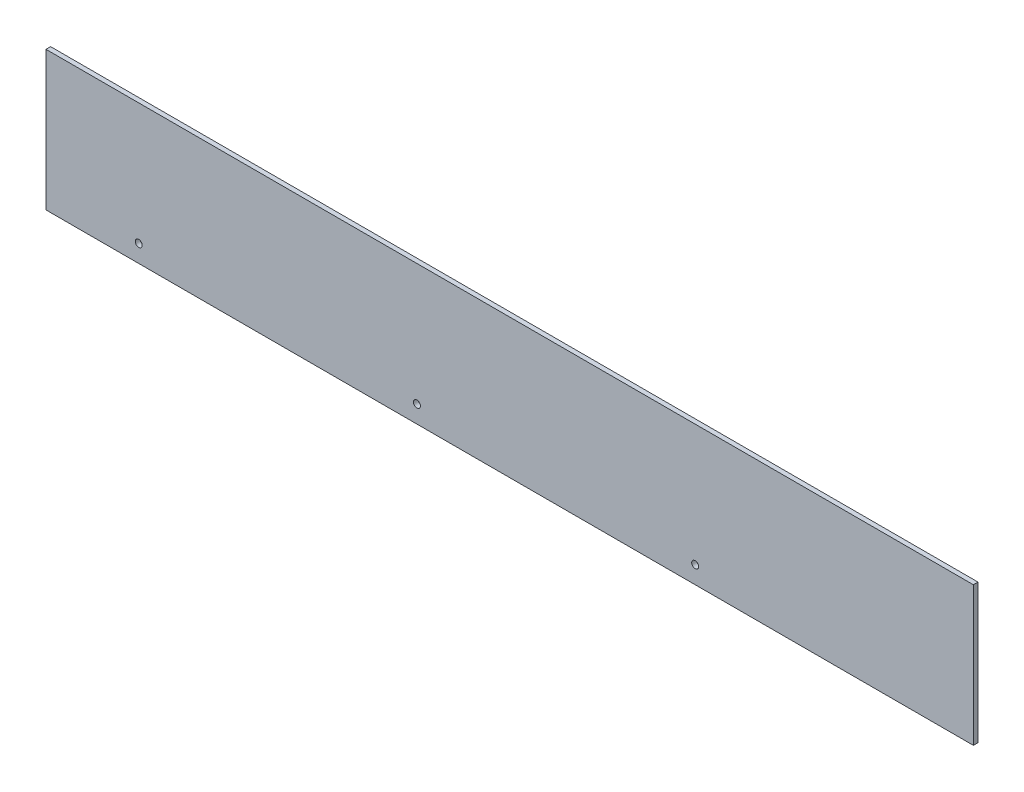
ISO-10303-21;
HEADER;
FILE_DESCRIPTION(('STEP AP214'),'2;1');
FILE_NAME('part.step','',(''),(''),'','','');
FILE_SCHEMA(('AUTOMOTIVE_DESIGN { 1 0 10303 214 1 1 1 1 }'));
ENDSEC;
DATA;
#1=APPLICATION_CONTEXT('core data for automotive mechanical design processes');
#2=APPLICATION_PROTOCOL_DEFINITION('international standard','automotive_design',2000,#1);
#3=PRODUCT_CONTEXT('',#1,'mechanical');
#4=PRODUCT('Part','Part','',(#3));
#5=PRODUCT_RELATED_PRODUCT_CATEGORY('part','',(#4));
#6=PRODUCT_DEFINITION_FORMATION('','',#4);
#7=PRODUCT_DEFINITION_CONTEXT('part definition',#1,'design');
#8=PRODUCT_DEFINITION('design','',#6,#7);
#9=PRODUCT_DEFINITION_SHAPE('','',#8);
#10=(LENGTH_UNIT() NAMED_UNIT(*) SI_UNIT(.MILLI.,.METRE.));
#11=(NAMED_UNIT(*) PLANE_ANGLE_UNIT() SI_UNIT($,.RADIAN.));
#12=(NAMED_UNIT(*) SI_UNIT($,.STERADIAN.) SOLID_ANGLE_UNIT());
#13=UNCERTAINTY_MEASURE_WITH_UNIT(LENGTH_MEASURE(1.E-05),#10,'distance_accuracy_value','');
#14=(GEOMETRIC_REPRESENTATION_CONTEXT(3) GLOBAL_UNCERTAINTY_ASSIGNED_CONTEXT((#13)) GLOBAL_UNIT_ASSIGNED_CONTEXT((#10,
#11,#12)) REPRESENTATION_CONTEXT('',''));
#15=CARTESIAN_POINT('',(0.,0.,0.));
#16=DIRECTION('',(0.,0.,1.));
#17=DIRECTION('',(1.,0.,0.));
#18=AXIS2_PLACEMENT_3D('',#15,#16,#17);
#19=CARTESIAN_POINT('',(200.,30.,2.));
#20=DIRECTION('',(-1.,0.,0.));
#21=DIRECTION('',(0.,0.,1.));
#22=AXIS2_PLACEMENT_3D('',#19,#20,#21);
#23=PLANE('',#22);
#24=DIRECTION('',(0.,1.,0.));
#25=VECTOR('',#24,1.);
#26=CARTESIAN_POINT('',(200.,30.,0.));
#27=LINE('',#26,#25);
#28=CARTESIAN_POINT('',(200.,-30.,0.));
#29=VERTEX_POINT('',#28);
#30=CARTESIAN_POINT('',(200.,30.,0.));
#31=VERTEX_POINT('',#30);
#32=EDGE_CURVE('E107',#29,#31,#27,.T.);
#33=ORIENTED_EDGE('',*,*,#32,.T.);
#34=DIRECTION('',(0.,0.,-1.));
#35=VECTOR('',#34,1.);
#36=CARTESIAN_POINT('',(200.,30.,2.));
#37=LINE('',#36,#35);
#38=CARTESIAN_POINT('',(200.,30.,2.));
#39=VERTEX_POINT('',#38);
#40=EDGE_CURVE('E11',#39,#31,#37,.T.);
#41=ORIENTED_EDGE('',*,*,#40,.F.);
#42=DIRECTION('',(0.,1.,0.));
#43=VECTOR('',#42,1.);
#44=CARTESIAN_POINT('',(200.,30.,2.));
#45=LINE('',#44,#43);
#46=CARTESIAN_POINT('',(200.,-30.,2.));
#47=VERTEX_POINT('',#46);
#48=EDGE_CURVE('E91',#47,#39,#45,.T.);
#49=ORIENTED_EDGE('',*,*,#48,.F.);
#50=DIRECTION('',(0.,0.,-1.));
#51=VECTOR('',#50,1.);
#52=CARTESIAN_POINT('',(200.,-30.,2.));
#53=LINE('',#52,#51);
#54=EDGE_CURVE('E103',#47,#29,#53,.T.);
#55=ORIENTED_EDGE('',*,*,#54,.T.);
#56=EDGE_LOOP('',(#33,#41,#49,#55));
#57=FACE_BOUND('',#56,.T.);
#58=ADVANCED_FACE('F39',(#57),#23,.F.);
#59=CARTESIAN_POINT('',(-200.,30.,2.));
#60=DIRECTION('',(0.,-1.,0.));
#61=DIRECTION('',(0.,0.,-1.));
#62=AXIS2_PLACEMENT_3D('',#59,#60,#61);
#63=PLANE('',#62);
#64=DIRECTION('',(-1.,0.,0.));
#65=VECTOR('',#64,1.);
#66=CARTESIAN_POINT('',(-200.,30.,0.));
#67=LINE('',#66,#65);
#68=CARTESIAN_POINT('',(-200.,30.,0.));
#69=VERTEX_POINT('',#68);
#70=EDGE_CURVE('E96',#31,#69,#67,.T.);
#71=ORIENTED_EDGE('',*,*,#70,.T.);
#72=DIRECTION('',(0.,0.,-1.));
#73=VECTOR('',#72,1.);
#74=CARTESIAN_POINT('',(-200.,30.,2.));
#75=LINE('',#74,#73);
#76=CARTESIAN_POINT('',(-200.,30.,2.));
#77=VERTEX_POINT('',#76);
#78=EDGE_CURVE('E48',#77,#69,#75,.T.);
#79=ORIENTED_EDGE('',*,*,#78,.F.);
#80=DIRECTION('',(-1.,0.,0.));
#81=VECTOR('',#80,1.);
#82=CARTESIAN_POINT('',(-200.,30.,2.));
#83=LINE('',#82,#81);
#84=EDGE_CURVE('E86',#39,#77,#83,.T.);
#85=ORIENTED_EDGE('',*,*,#84,.F.);
#86=ORIENTED_EDGE('',*,*,#40,.T.);
#87=EDGE_LOOP('',(#71,#79,#85,#86));
#88=FACE_BOUND('',#87,.T.);
#89=ADVANCED_FACE('F95',(#88),#63,.F.);
#90=CARTESIAN_POINT('',(-200.,30.,2.));
#91=DIRECTION('',(1.,0.,0.));
#92=DIRECTION('',(0.,0.,-1.));
#93=AXIS2_PLACEMENT_3D('',#90,#91,#92);
#94=PLANE('',#93);
#95=DIRECTION('',(0.,-1.,0.));
#96=VECTOR('',#95,1.);
#97=CARTESIAN_POINT('',(-200.,30.,0.));
#98=LINE('',#97,#96);
#99=CARTESIAN_POINT('',(-200.,-30.,0.));
#100=VERTEX_POINT('',#99);
#101=EDGE_CURVE('E73',#69,#100,#98,.T.);
#102=ORIENTED_EDGE('',*,*,#101,.T.);
#103=DIRECTION('',(0.,0.,-1.));
#104=VECTOR('',#103,1.);
#105=CARTESIAN_POINT('',(-200.,-30.,2.));
#106=LINE('',#105,#104);
#107=CARTESIAN_POINT('',(-200.,-30.,2.));
#108=VERTEX_POINT('',#107);
#109=EDGE_CURVE('E98',#108,#100,#106,.T.);
#110=ORIENTED_EDGE('',*,*,#109,.F.);
#111=DIRECTION('',(0.,-1.,0.));
#112=VECTOR('',#111,1.);
#113=CARTESIAN_POINT('',(-200.,30.,2.));
#114=LINE('',#113,#112);
#115=EDGE_CURVE('E89',#77,#108,#114,.T.);
#116=ORIENTED_EDGE('',*,*,#115,.F.);
#117=ORIENTED_EDGE('',*,*,#78,.T.);
#118=EDGE_LOOP('',(#102,#110,#116,#117));
#119=FACE_BOUND('',#118,.T.);
#120=ADVANCED_FACE('F99',(#119),#94,.F.);
#121=CARTESIAN_POINT('',(-200.,-30.,2.));
#122=DIRECTION('',(0.,1.,0.));
#123=DIRECTION('',(0.,0.,1.));
#124=AXIS2_PLACEMENT_3D('',#121,#122,#123);
#125=PLANE('',#124);
#126=DIRECTION('',(1.,0.,0.));
#127=VECTOR('',#126,1.);
#128=CARTESIAN_POINT('',(-200.,-30.,0.));
#129=LINE('',#128,#127);
#130=EDGE_CURVE('E79',#100,#29,#129,.T.);
#131=ORIENTED_EDGE('',*,*,#130,.T.);
#132=ORIENTED_EDGE('',*,*,#54,.F.);
#133=DIRECTION('',(1.,0.,0.));
#134=VECTOR('',#133,1.);
#135=CARTESIAN_POINT('',(-200.,-30.,2.));
#136=LINE('',#135,#134);
#137=EDGE_CURVE('E56',#108,#47,#136,.T.);
#138=ORIENTED_EDGE('',*,*,#137,.F.);
#139=ORIENTED_EDGE('',*,*,#109,.T.);
#140=EDGE_LOOP('',(#131,#132,#138,#139));
#141=FACE_BOUND('',#140,.T.);
#142=ADVANCED_FACE('F121',(#141),#125,.F.);
#143=CARTESIAN_POINT('',(0.,0.,2.));
#144=DIRECTION('',(0.,0.,1.));
#145=DIRECTION('',(1.,0.,0.));
#146=AXIS2_PLACEMENT_3D('',#143,#144,#145);
#147=PLANE('',#146);
#148=CARTESIAN_POINT('',(-160.,-22.5,2.));
#149=DIRECTION('',(0.,0.,1.));
#150=DIRECTION('',(1.,0.,0.));
#151=AXIS2_PLACEMENT_3D('',#148,#149,#150);
#152=CIRCLE('',#151,1.5);
#153=CARTESIAN_POINT('',(-158.5,-22.5,2.));
#154=VERTEX_POINT('',#153);
#155=EDGE_CURVE('E144',#154,#154,#152,.T.);
#156=ORIENTED_EDGE('',*,*,#155,.F.);
#157=EDGE_LOOP('',(#156));
#158=FACE_BOUND('',#157,.T.);
#159=CARTESIAN_POINT('',(-40.,-22.5,2.));
#160=DIRECTION('',(0.,0.,1.));
#161=DIRECTION('',(1.,0.,0.));
#162=AXIS2_PLACEMENT_3D('',#159,#160,#161);
#163=CIRCLE('',#162,1.5);
#164=CARTESIAN_POINT('',(-38.5,-22.5,2.));
#165=VERTEX_POINT('',#164);
#166=EDGE_CURVE('E136',#165,#165,#163,.T.);
#167=ORIENTED_EDGE('',*,*,#166,.F.);
#168=EDGE_LOOP('',(#167));
#169=FACE_BOUND('',#168,.T.);
#170=CARTESIAN_POINT('',(80.,-22.5,2.));
#171=DIRECTION('',(0.,0.,1.));
#172=DIRECTION('',(1.,0.,0.));
#173=AXIS2_PLACEMENT_3D('',#170,#171,#172);
#174=CIRCLE('',#173,1.5);
#175=CARTESIAN_POINT('',(81.5,-22.5,2.));
#176=VERTEX_POINT('',#175);
#177=EDGE_CURVE('E128',#176,#176,#174,.T.);
#178=ORIENTED_EDGE('',*,*,#177,.F.);
#179=EDGE_LOOP('',(#178));
#180=FACE_BOUND('',#179,.T.);
#181=ORIENTED_EDGE('',*,*,#48,.T.);
#182=ORIENTED_EDGE('',*,*,#84,.T.);
#183=ORIENTED_EDGE('',*,*,#115,.T.);
#184=ORIENTED_EDGE('',*,*,#137,.T.);
#185=EDGE_LOOP('',(#181,#182,#183,#184));
#186=FACE_BOUND('',#185,.T.);
#187=ADVANCED_FACE('F87',(#158,#169,#180,#186),#147,.T.);
#188=CARTESIAN_POINT('',(0.,0.,0.));
#189=DIRECTION('',(0.,0.,1.));
#190=DIRECTION('',(1.,0.,0.));
#191=AXIS2_PLACEMENT_3D('',#188,#189,#190);
#192=PLANE('',#191);
#193=CARTESIAN_POINT('',(-160.,-22.5,0.));
#194=DIRECTION('',(0.,0.,1.));
#195=DIRECTION('',(1.,0.,0.));
#196=AXIS2_PLACEMENT_3D('',#193,#194,#195);
#197=CIRCLE('',#196,1.5);
#198=CARTESIAN_POINT('',(-158.5,-22.5,0.));
#199=VERTEX_POINT('',#198);
#200=EDGE_CURVE('E111',#199,#199,#197,.T.);
#201=ORIENTED_EDGE('',*,*,#200,.T.);
#202=EDGE_LOOP('',(#201));
#203=FACE_BOUND('',#202,.T.);
#204=CARTESIAN_POINT('',(-40.,-22.5,0.));
#205=DIRECTION('',(0.,0.,1.));
#206=DIRECTION('',(1.,0.,0.));
#207=AXIS2_PLACEMENT_3D('',#204,#205,#206);
#208=CIRCLE('',#207,1.5);
#209=CARTESIAN_POINT('',(-38.5,-22.5,0.));
#210=VERTEX_POINT('',#209);
#211=EDGE_CURVE('E140',#210,#210,#208,.T.);
#212=ORIENTED_EDGE('',*,*,#211,.T.);
#213=EDGE_LOOP('',(#212));
#214=FACE_BOUND('',#213,.T.);
#215=CARTESIAN_POINT('',(80.,-22.5,0.));
#216=DIRECTION('',(0.,0.,1.));
#217=DIRECTION('',(1.,0.,0.));
#218=AXIS2_PLACEMENT_3D('',#215,#216,#217);
#219=CIRCLE('',#218,1.5);
#220=CARTESIAN_POINT('',(81.5,-22.5,0.));
#221=VERTEX_POINT('',#220);
#222=EDGE_CURVE('E132',#221,#221,#219,.T.);
#223=ORIENTED_EDGE('',*,*,#222,.T.);
#224=EDGE_LOOP('',(#223));
#225=FACE_BOUND('',#224,.T.);
#226=ORIENTED_EDGE('',*,*,#32,.F.);
#227=ORIENTED_EDGE('',*,*,#130,.F.);
#228=ORIENTED_EDGE('',*,*,#101,.F.);
#229=ORIENTED_EDGE('',*,*,#70,.F.);
#230=EDGE_LOOP('',(#226,#227,#228,#229));
#231=FACE_BOUND('',#230,.T.);
#232=ADVANCED_FACE('F124',(#203,#214,#225,#231),#192,.F.);
#233=CARTESIAN_POINT('',(80.,-22.5,0.));
#234=DIRECTION('',(0.,0.,1.));
#235=DIRECTION('',(1.,0.,0.));
#236=AXIS2_PLACEMENT_3D('',#233,#234,#235);
#237=CYLINDRICAL_SURFACE('',#236,1.5);
#238=ORIENTED_EDGE('',*,*,#222,.F.);
#239=EDGE_LOOP('',(#238));
#240=FACE_BOUND('',#239,.T.);
#241=ORIENTED_EDGE('',*,*,#177,.T.);
#242=EDGE_LOOP('',(#241));
#243=FACE_BOUND('',#242,.T.);
#244=ADVANCED_FACE('F168',(#240,#243),#237,.F.);
#245=CARTESIAN_POINT('',(-40.,-22.5,0.));
#246=DIRECTION('',(0.,0.,1.));
#247=DIRECTION('',(1.,0.,0.));
#248=AXIS2_PLACEMENT_3D('',#245,#246,#247);
#249=CYLINDRICAL_SURFACE('',#248,1.5);
#250=ORIENTED_EDGE('',*,*,#211,.F.);
#251=EDGE_LOOP('',(#250));
#252=FACE_BOUND('',#251,.T.);
#253=ORIENTED_EDGE('',*,*,#166,.T.);
#254=EDGE_LOOP('',(#253));
#255=FACE_BOUND('',#254,.T.);
#256=ADVANCED_FACE('F157',(#252,#255),#249,.F.);
#257=CARTESIAN_POINT('',(-160.,-22.5,0.));
#258=DIRECTION('',(0.,0.,1.));
#259=DIRECTION('',(1.,0.,0.));
#260=AXIS2_PLACEMENT_3D('',#257,#258,#259);
#261=CYLINDRICAL_SURFACE('',#260,1.5);
#262=ORIENTED_EDGE('',*,*,#200,.F.);
#263=EDGE_LOOP('',(#262));
#264=FACE_BOUND('',#263,.T.);
#265=ORIENTED_EDGE('',*,*,#155,.T.);
#266=EDGE_LOOP('',(#265));
#267=FACE_BOUND('',#266,.T.);
#268=ADVANCED_FACE('F154',(#264,#267),#261,.F.);
#269=CLOSED_SHELL('',(#58,#89,#120,#142,#187,#232,#244,#256,#268));
#270=MANIFOLD_SOLID_BREP('B2',#269);
#271=ADVANCED_BREP_SHAPE_REPRESENTATION('',(#18,#270),#14);
#272=SHAPE_DEFINITION_REPRESENTATION(#9,#271);
ENDSEC;
END-ISO-10303-21;
